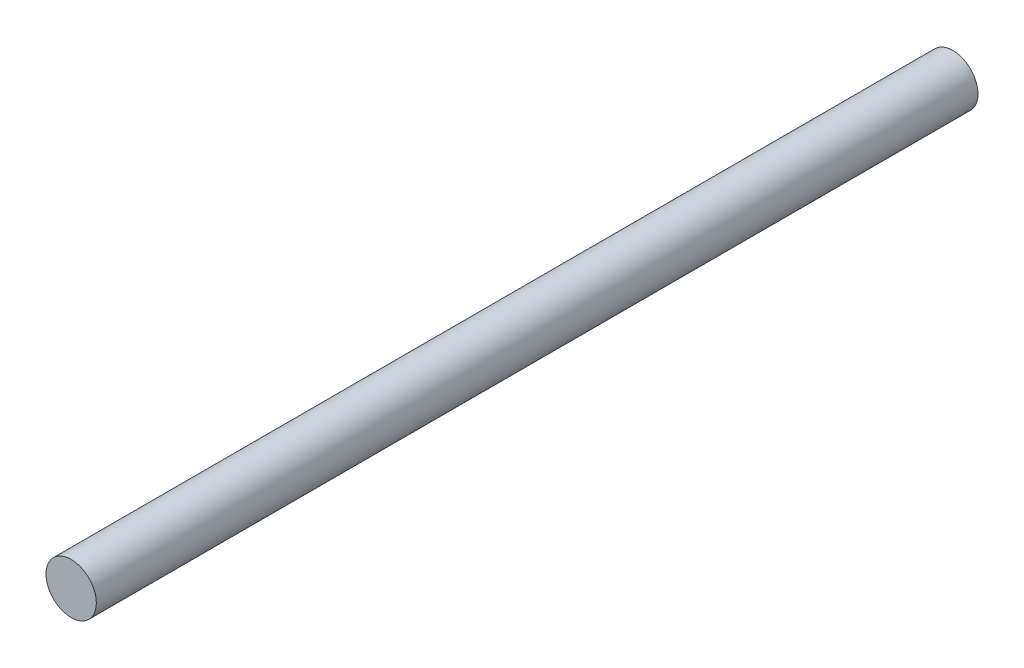
ISO-10303-21;
HEADER;
FILE_DESCRIPTION(('STEP AP214'),'2;1');
FILE_NAME('part.step','',(''),(''),'','','');
FILE_SCHEMA(('AUTOMOTIVE_DESIGN { 1 0 10303 214 1 1 1 1 }'));
ENDSEC;
DATA;
#1=APPLICATION_CONTEXT('core data for automotive mechanical design processes');
#2=APPLICATION_PROTOCOL_DEFINITION('international standard','automotive_design',2000,#1);
#3=PRODUCT_CONTEXT('',#1,'mechanical');
#4=PRODUCT('Part','Part','',(#3));
#5=PRODUCT_RELATED_PRODUCT_CATEGORY('part','',(#4));
#6=PRODUCT_DEFINITION_FORMATION('','',#4);
#7=PRODUCT_DEFINITION_CONTEXT('part definition',#1,'design');
#8=PRODUCT_DEFINITION('design','',#6,#7);
#9=PRODUCT_DEFINITION_SHAPE('','',#8);
#10=(LENGTH_UNIT() NAMED_UNIT(*) SI_UNIT(.MILLI.,.METRE.));
#11=(NAMED_UNIT(*) PLANE_ANGLE_UNIT() SI_UNIT($,.RADIAN.));
#12=(NAMED_UNIT(*) SI_UNIT($,.STERADIAN.) SOLID_ANGLE_UNIT());
#13=UNCERTAINTY_MEASURE_WITH_UNIT(LENGTH_MEASURE(1.E-05),#10,'distance_accuracy_value','');
#14=(GEOMETRIC_REPRESENTATION_CONTEXT(3) GLOBAL_UNCERTAINTY_ASSIGNED_CONTEXT((#13)) GLOBAL_UNIT_ASSIGNED_CONTEXT((#10,
#11,#12)) REPRESENTATION_CONTEXT('',''));
#15=CARTESIAN_POINT('',(0.,0.,0.));
#16=DIRECTION('',(0.,0.,1.));
#17=DIRECTION('',(1.,0.,0.));
#18=AXIS2_PLACEMENT_3D('',#15,#16,#17);
#19=CARTESIAN_POINT('',(0.,0.,17.5));
#20=DIRECTION('',(0.,0.,-1.));
#21=DIRECTION('',(-1.,0.,0.));
#22=AXIS2_PLACEMENT_3D('',#19,#20,#21);
#23=CYLINDRICAL_SURFACE('',#22,1.);
#24=CARTESIAN_POINT('',(0.,0.,17.5));
#25=DIRECTION('',(0.,0.,1.));
#26=DIRECTION('',(1.,0.,0.));
#27=AXIS2_PLACEMENT_3D('',#24,#25,#26);
#28=CIRCLE('',#27,1.);
#29=CARTESIAN_POINT('',(1.,0.,17.5));
#30=VERTEX_POINT('',#29);
#31=EDGE_CURVE('E10',#30,#30,#28,.T.);
#32=ORIENTED_EDGE('',*,*,#31,.F.);
#33=EDGE_LOOP('',(#32));
#34=FACE_BOUND('',#33,.T.);
#35=CARTESIAN_POINT('',(0.,0.,-17.5));
#36=DIRECTION('',(0.,0.,1.));
#37=DIRECTION('',(1.,0.,0.));
#38=AXIS2_PLACEMENT_3D('',#35,#36,#37);
#39=CIRCLE('',#38,1.);
#40=CARTESIAN_POINT('',(1.,0.,-17.5));
#41=VERTEX_POINT('',#40);
#42=EDGE_CURVE('E40',#41,#41,#39,.T.);
#43=ORIENTED_EDGE('',*,*,#42,.T.);
#44=EDGE_LOOP('',(#43));
#45=FACE_BOUND('',#44,.T.);
#46=ADVANCED_FACE('F37',(#34,#45),#23,.T.);
#47=CARTESIAN_POINT('',(0.,0.,17.5));
#48=DIRECTION('',(0.,0.,1.));
#49=DIRECTION('',(1.,0.,0.));
#50=AXIS2_PLACEMENT_3D('',#47,#48,#49);
#51=PLANE('',#50);
#52=ORIENTED_EDGE('',*,*,#31,.T.);
#53=EDGE_LOOP('',(#52));
#54=FACE_BOUND('',#53,.T.);
#55=ADVANCED_FACE('F54',(#54),#51,.T.);
#56=CARTESIAN_POINT('',(0.,0.,-17.5));
#57=DIRECTION('',(0.,0.,1.));
#58=DIRECTION('',(1.,0.,0.));
#59=AXIS2_PLACEMENT_3D('',#56,#57,#58);
#60=PLANE('',#59);
#61=ORIENTED_EDGE('',*,*,#42,.F.);
#62=EDGE_LOOP('',(#61));
#63=FACE_BOUND('',#62,.T.);
#64=ADVANCED_FACE('F52',(#63),#60,.F.);
#65=CLOSED_SHELL('',(#46,#55,#64));
#66=MANIFOLD_SOLID_BREP('B2',#65);
#67=ADVANCED_BREP_SHAPE_REPRESENTATION('',(#18,#66),#14);
#68=SHAPE_DEFINITION_REPRESENTATION(#9,#67);
ENDSEC;
END-ISO-10303-21;
